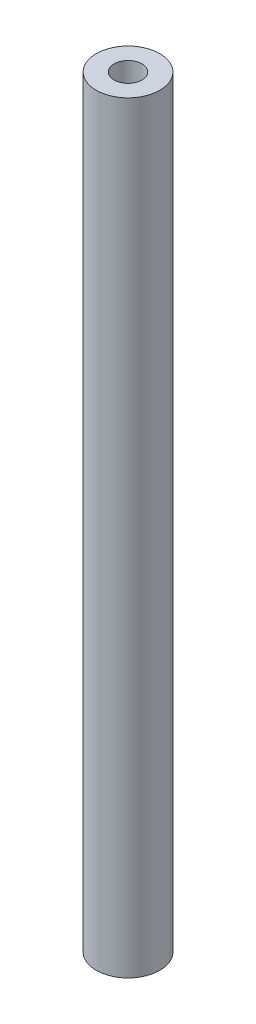
ISO-10303-21;
HEADER;
FILE_DESCRIPTION(('STEP AP214'),'2;1');
FILE_NAME('part.step','',(''),(''),'','','');
FILE_SCHEMA(('AUTOMOTIVE_DESIGN { 1 0 10303 214 1 1 1 1 }'));
ENDSEC;
DATA;
#1=APPLICATION_CONTEXT('core data for automotive mechanical design processes');
#2=APPLICATION_PROTOCOL_DEFINITION('international standard','automotive_design',2000,#1);
#3=PRODUCT_CONTEXT('',#1,'mechanical');
#4=PRODUCT('Part','Part','',(#3));
#5=PRODUCT_RELATED_PRODUCT_CATEGORY('part','',(#4));
#6=PRODUCT_DEFINITION_FORMATION('','',#4);
#7=PRODUCT_DEFINITION_CONTEXT('part definition',#1,'design');
#8=PRODUCT_DEFINITION('design','',#6,#7);
#9=PRODUCT_DEFINITION_SHAPE('','',#8);
#10=(LENGTH_UNIT() NAMED_UNIT(*) SI_UNIT(.MILLI.,.METRE.));
#11=(NAMED_UNIT(*) PLANE_ANGLE_UNIT() SI_UNIT($,.RADIAN.));
#12=(NAMED_UNIT(*) SI_UNIT($,.STERADIAN.) SOLID_ANGLE_UNIT());
#13=UNCERTAINTY_MEASURE_WITH_UNIT(LENGTH_MEASURE(1.E-05),#10,'distance_accuracy_value','');
#14=(GEOMETRIC_REPRESENTATION_CONTEXT(3) GLOBAL_UNCERTAINTY_ASSIGNED_CONTEXT((#13)) GLOBAL_UNIT_ASSIGNED_CONTEXT((#10,
#11,#12)) REPRESENTATION_CONTEXT('',''));
#15=CARTESIAN_POINT('',(0.,0.,0.));
#16=DIRECTION('',(0.,0.,1.));
#17=DIRECTION('',(1.,0.,0.));
#18=AXIS2_PLACEMENT_3D('',#15,#16,#17);
#19=CARTESIAN_POINT('',(0.,0.,0.));
#20=DIRECTION('',(0.,1.,0.));
#21=DIRECTION('',(1.,0.,0.));
#22=AXIS2_PLACEMENT_3D('',#19,#20,#21);
#23=PLANE('',#22);
#24=CARTESIAN_POINT('',(0.,0.,0.));
#25=DIRECTION('',(0.,-1.,0.));
#26=DIRECTION('',(1.,0.,0.));
#27=AXIS2_PLACEMENT_3D('',#24,#25,#26);
#28=CIRCLE('',#27,0.6985);
#29=CARTESIAN_POINT('',(-0.6985,0.,0.));
#30=VERTEX_POINT('',#29);
#31=EDGE_CURVE('E19',#30,#30,#28,.T.);
#32=ORIENTED_EDGE('',*,*,#31,.F.);
#33=EDGE_LOOP('',(#32));
#34=FACE_BOUND('',#33,.T.);
#35=CARTESIAN_POINT('',(0.,0.,0.));
#36=DIRECTION('',(0.,1.,0.));
#37=DIRECTION('',(-1.,0.,0.));
#38=AXIS2_PLACEMENT_3D('',#35,#36,#37);
#39=CIRCLE('',#38,1.5875);
#40=CARTESIAN_POINT('',(1.5875,0.,0.));
#41=VERTEX_POINT('',#40);
#42=EDGE_CURVE('E11',#41,#41,#39,.T.);
#43=ORIENTED_EDGE('',*,*,#42,.F.);
#44=EDGE_LOOP('',(#43));
#45=FACE_BOUND('',#44,.T.);
#46=ADVANCED_FACE('F16',(#34,#45),#23,.F.);
#47=CARTESIAN_POINT('',(0.,38.1,0.));
#48=DIRECTION('',(0.,1.,0.));
#49=DIRECTION('',(1.,0.,0.));
#50=AXIS2_PLACEMENT_3D('',#47,#48,#49);
#51=PLANE('',#50);
#52=CARTESIAN_POINT('',(0.,38.1,0.));
#53=DIRECTION('',(0.,-1.,0.));
#54=DIRECTION('',(1.,0.,0.));
#55=AXIS2_PLACEMENT_3D('',#52,#53,#54);
#56=CIRCLE('',#55,0.6985);
#57=CARTESIAN_POINT('',(-0.6985,38.1,0.));
#58=VERTEX_POINT('',#57);
#59=EDGE_CURVE('E55',#58,#58,#56,.T.);
#60=ORIENTED_EDGE('',*,*,#59,.T.);
#61=EDGE_LOOP('',(#60));
#62=FACE_BOUND('',#61,.T.);
#63=CARTESIAN_POINT('',(0.,38.1,0.));
#64=DIRECTION('',(0.,1.,0.));
#65=DIRECTION('',(-1.,0.,0.));
#66=AXIS2_PLACEMENT_3D('',#63,#64,#65);
#67=CIRCLE('',#66,1.5875);
#68=CARTESIAN_POINT('',(1.5875,38.1,0.));
#69=VERTEX_POINT('',#68);
#70=EDGE_CURVE('E67',#69,#69,#67,.T.);
#71=ORIENTED_EDGE('',*,*,#70,.T.);
#72=EDGE_LOOP('',(#71));
#73=FACE_BOUND('',#72,.T.);
#74=ADVANCED_FACE('F59',(#62,#73),#51,.T.);
#75=CARTESIAN_POINT('',(0.,0.,0.));
#76=DIRECTION('',(0.,1.,0.));
#77=DIRECTION('',(-1.,0.,0.));
#78=AXIS2_PLACEMENT_3D('',#75,#76,#77);
#79=CYLINDRICAL_SURFACE('',#78,1.5875);
#80=ORIENTED_EDGE('',*,*,#70,.F.);
#81=DIRECTION('',(0.,-1.,0.));
#82=VECTOR('',#81,1.);
#83=CARTESIAN_POINT('',(1.5875,0.,0.));
#84=LINE('',#83,#82);
#85=EDGE_CURVE('E26',#69,#41,#84,.T.);
#86=ORIENTED_EDGE('',*,*,#85,.T.);
#87=ORIENTED_EDGE('',*,*,#42,.T.);
#88=ORIENTED_EDGE('',*,*,#85,.F.);
#89=EDGE_LOOP('',(#80,#86,#87,#88));
#90=FACE_BOUND('',#89,.T.);
#91=ADVANCED_FACE('F107',(#90),#79,.T.);
#92=CARTESIAN_POINT('',(0.,0.,0.));
#93=DIRECTION('',(0.,1.,0.));
#94=DIRECTION('',(1.,0.,0.));
#95=AXIS2_PLACEMENT_3D('',#92,#93,#94);
#96=CYLINDRICAL_SURFACE('',#95,0.6985);
#97=ORIENTED_EDGE('',*,*,#59,.F.);
#98=DIRECTION('',(0.,-1.,0.));
#99=VECTOR('',#98,1.);
#100=CARTESIAN_POINT('',(-0.6985,0.,0.));
#101=LINE('',#100,#99);
#102=EDGE_CURVE('E52',#58,#30,#101,.T.);
#103=ORIENTED_EDGE('',*,*,#102,.T.);
#104=ORIENTED_EDGE('',*,*,#31,.T.);
#105=ORIENTED_EDGE('',*,*,#102,.F.);
#106=EDGE_LOOP('',(#97,#103,#104,#105));
#107=FACE_BOUND('',#106,.T.);
#108=ADVANCED_FACE('F54',(#107),#96,.F.);
#109=CLOSED_SHELL('',(#46,#74,#91,#108));
#110=MANIFOLD_SOLID_BREP('B1',#109);
#111=ADVANCED_BREP_SHAPE_REPRESENTATION('',(#18,#110),#14);
#112=SHAPE_DEFINITION_REPRESENTATION(#9,#111);
ENDSEC;
END-ISO-10303-21;
